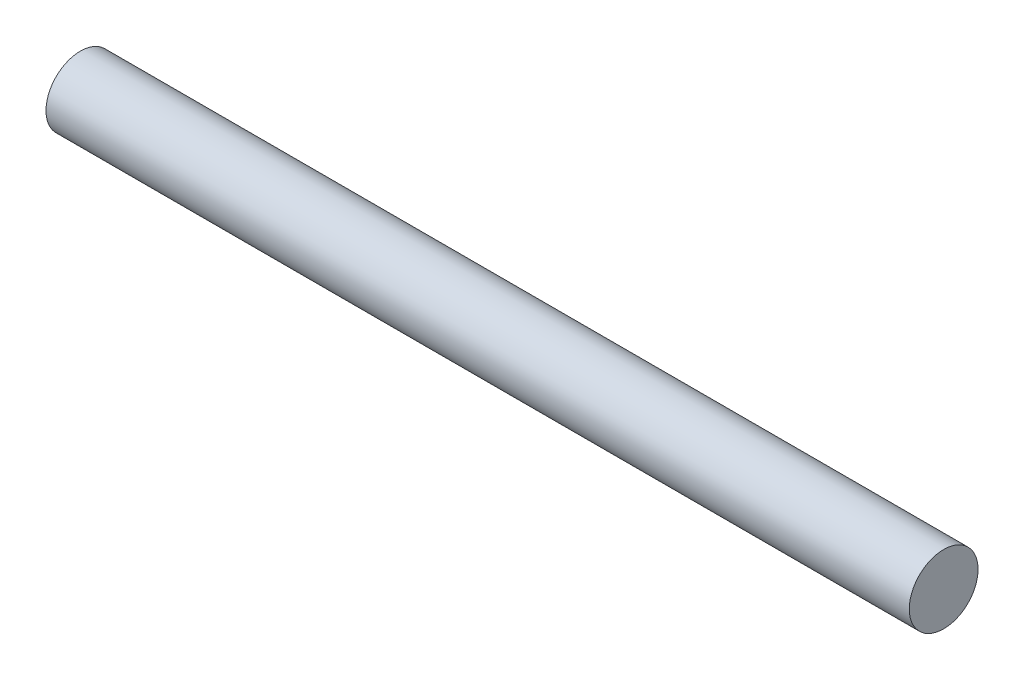
ISO-10303-21;
HEADER;
FILE_DESCRIPTION(('STEP AP214'),'2;1');
FILE_NAME('part.step','',(''),(''),'','','');
FILE_SCHEMA(('AUTOMOTIVE_DESIGN { 1 0 10303 214 1 1 1 1 }'));
ENDSEC;
DATA;
#1=APPLICATION_CONTEXT('core data for automotive mechanical design processes');
#2=APPLICATION_PROTOCOL_DEFINITION('international standard','automotive_design',2000,#1);
#3=PRODUCT_CONTEXT('',#1,'mechanical');
#4=PRODUCT('Part','Part','',(#3));
#5=PRODUCT_RELATED_PRODUCT_CATEGORY('part','',(#4));
#6=PRODUCT_DEFINITION_FORMATION('','',#4);
#7=PRODUCT_DEFINITION_CONTEXT('part definition',#1,'design');
#8=PRODUCT_DEFINITION('design','',#6,#7);
#9=PRODUCT_DEFINITION_SHAPE('','',#8);
#10=(LENGTH_UNIT() NAMED_UNIT(*) SI_UNIT(.MILLI.,.METRE.));
#11=(NAMED_UNIT(*) PLANE_ANGLE_UNIT() SI_UNIT($,.RADIAN.));
#12=(NAMED_UNIT(*) SI_UNIT($,.STERADIAN.) SOLID_ANGLE_UNIT());
#13=UNCERTAINTY_MEASURE_WITH_UNIT(LENGTH_MEASURE(1.E-05),#10,'distance_accuracy_value','');
#14=(GEOMETRIC_REPRESENTATION_CONTEXT(3) GLOBAL_UNCERTAINTY_ASSIGNED_CONTEXT((#13)) GLOBAL_UNIT_ASSIGNED_CONTEXT((#10,
#11,#12)) REPRESENTATION_CONTEXT('',''));
#15=CARTESIAN_POINT('',(0.,0.,0.));
#16=DIRECTION('',(0.,0.,1.));
#17=DIRECTION('',(1.,0.,0.));
#18=AXIS2_PLACEMENT_3D('',#15,#16,#17);
#19=CARTESIAN_POINT('',(0.,0.,-63.7499999999998));
#20=DIRECTION('',(-1.,0.,0.));
#21=DIRECTION('',(0.,0.,1.));
#22=AXIS2_PLACEMENT_3D('',#19,#20,#21);
#23=PLANE('',#22);
#24=CARTESIAN_POINT('',(0.,0.,-63.7499999999998));
#25=DIRECTION('',(-1.,0.,0.));
#26=DIRECTION('',(0.,0.,1.));
#27=AXIS2_PLACEMENT_3D('',#24,#25,#26);
#28=CIRCLE('',#27,63.7499999999998);
#29=CARTESIAN_POINT('',(0.,0.,0.));
#30=VERTEX_POINT('',#29);
#31=EDGE_CURVE('E10',#30,#30,#28,.T.);
#32=ORIENTED_EDGE('',*,*,#31,.T.);
#33=EDGE_LOOP('',(#32));
#34=FACE_BOUND('',#33,.T.);
#35=ADVANCED_FACE('F35',(#34),#23,.T.);
#36=CARTESIAN_POINT('',(1600.,0.,-63.75));
#37=DIRECTION('',(-1.,0.,0.));
#38=DIRECTION('',(0.,0.,1.));
#39=AXIS2_PLACEMENT_3D('',#36,#37,#38);
#40=CYLINDRICAL_SURFACE('',#39,63.7499999999999);
#41=CARTESIAN_POINT('',(1600.,0.,-63.75));
#42=DIRECTION('',(-1.,0.,0.));
#43=DIRECTION('',(0.,0.,1.));
#44=AXIS2_PLACEMENT_3D('',#41,#42,#43);
#45=CIRCLE('',#44,63.75);
#46=CARTESIAN_POINT('',(1600.,0.,0.));
#47=VERTEX_POINT('',#46);
#48=EDGE_CURVE('E41',#47,#47,#45,.T.);
#49=ORIENTED_EDGE('',*,*,#48,.T.);
#50=EDGE_LOOP('',(#49));
#51=FACE_BOUND('',#50,.T.);
#52=ORIENTED_EDGE('',*,*,#31,.F.);
#53=EDGE_LOOP('',(#52));
#54=FACE_BOUND('',#53,.T.);
#55=ADVANCED_FACE('F47',(#51,#54),#40,.T.);
#56=CARTESIAN_POINT('',(1600.,0.,0.));
#57=DIRECTION('',(1.,0.,0.));
#58=DIRECTION('',(0.,0.,-1.));
#59=AXIS2_PLACEMENT_3D('',#56,#57,#58);
#60=PLANE('',#59);
#61=ORIENTED_EDGE('',*,*,#48,.F.);
#62=EDGE_LOOP('',(#61));
#63=FACE_BOUND('',#62,.T.);
#64=ADVANCED_FACE('F50',(#63),#60,.T.);
#65=CLOSED_SHELL('',(#35,#55,#64));
#66=MANIFOLD_SOLID_BREP('B2',#65);
#67=ADVANCED_BREP_SHAPE_REPRESENTATION('',(#18,#66),#14);
#68=SHAPE_DEFINITION_REPRESENTATION(#9,#67);
ENDSEC;
END-ISO-10303-21;
